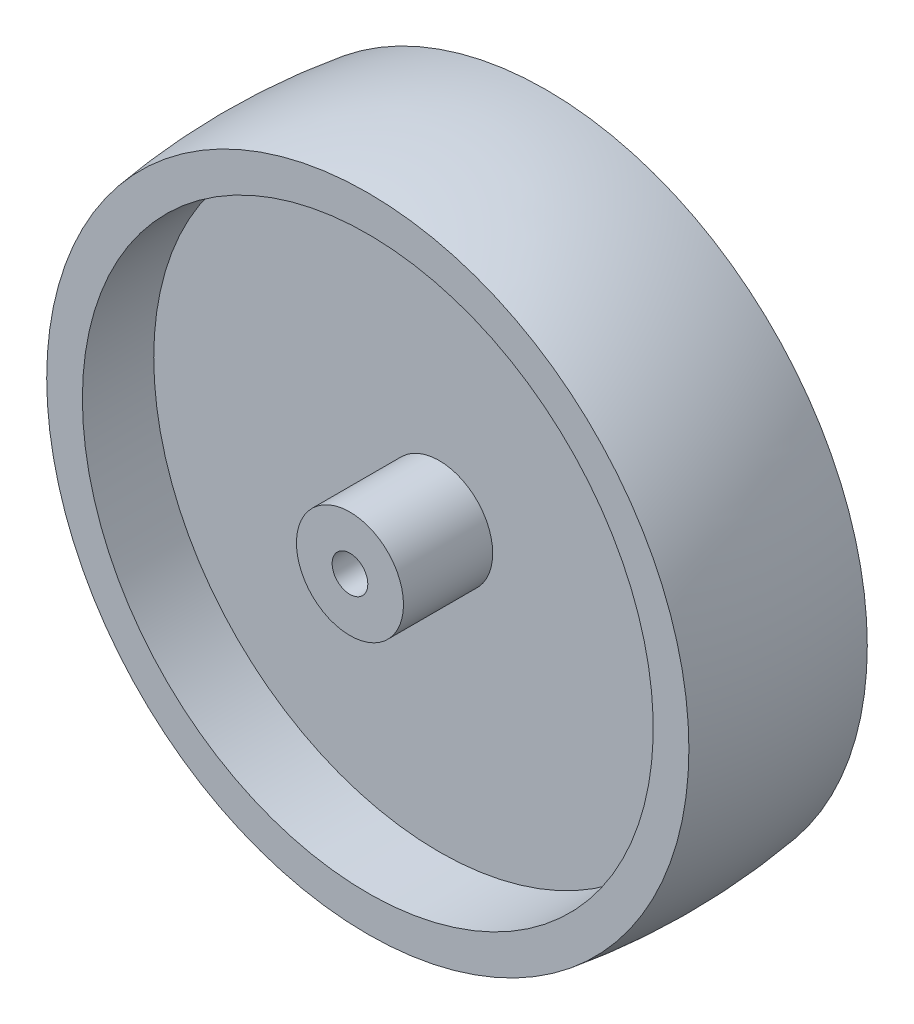
ISO-10303-21;
HEADER;
FILE_DESCRIPTION(('STEP AP214'),'2;1');
FILE_NAME('part.step','',(''),(''),'','','');
FILE_SCHEMA(('AUTOMOTIVE_DESIGN { 1 0 10303 214 1 1 1 1 }'));
ENDSEC;
DATA;
#1=APPLICATION_CONTEXT('core data for automotive mechanical design processes');
#2=APPLICATION_PROTOCOL_DEFINITION('international standard','automotive_design',2000,#1);
#3=PRODUCT_CONTEXT('',#1,'mechanical');
#4=PRODUCT('Part','Part','',(#3));
#5=PRODUCT_RELATED_PRODUCT_CATEGORY('part','',(#4));
#6=PRODUCT_DEFINITION_FORMATION('','',#4);
#7=PRODUCT_DEFINITION_CONTEXT('part definition',#1,'design');
#8=PRODUCT_DEFINITION('design','',#6,#7);
#9=PRODUCT_DEFINITION_SHAPE('','',#8);
#10=(LENGTH_UNIT() NAMED_UNIT(*) SI_UNIT(.MILLI.,.METRE.));
#11=(NAMED_UNIT(*) PLANE_ANGLE_UNIT() SI_UNIT($,.RADIAN.));
#12=(NAMED_UNIT(*) SI_UNIT($,.STERADIAN.) SOLID_ANGLE_UNIT());
#13=UNCERTAINTY_MEASURE_WITH_UNIT(LENGTH_MEASURE(1.E-05),#10,'distance_accuracy_value','');
#14=(GEOMETRIC_REPRESENTATION_CONTEXT(3) GLOBAL_UNCERTAINTY_ASSIGNED_CONTEXT((#13)) GLOBAL_UNIT_ASSIGNED_CONTEXT((#10,
#11,#12)) REPRESENTATION_CONTEXT('',''));
#15=CARTESIAN_POINT('',(0.,0.,0.));
#16=DIRECTION('',(0.,0.,1.));
#17=DIRECTION('',(1.,0.,0.));
#18=AXIS2_PLACEMENT_3D('',#15,#16,#17);
#19=CARTESIAN_POINT('',(0.,0.,60.));
#20=DIRECTION('',(0.,0.,-1.));
#21=DIRECTION('',(-1.,0.,0.));
#22=AXIS2_PLACEMENT_3D('',#19,#20,#21);
#23=CYLINDRICAL_SURFACE('',#22,15.);
#24=CARTESIAN_POINT('',(0.,0.,0.));
#25=DIRECTION('',(0.,0.,1.));
#26=DIRECTION('',(1.,0.,0.));
#27=AXIS2_PLACEMENT_3D('',#24,#25,#26);
#28=CIRCLE('',#27,15.);
#29=CARTESIAN_POINT('',(15.,0.,0.));
#30=VERTEX_POINT('',#29);
#31=EDGE_CURVE('E50',#30,#30,#28,.T.);
#32=ORIENTED_EDGE('',*,*,#31,.T.);
#33=EDGE_LOOP('',(#32));
#34=FACE_BOUND('',#33,.T.);
#35=CARTESIAN_POINT('',(0.,0.,25.));
#36=DIRECTION('',(0.,0.,1.));
#37=DIRECTION('',(1.,0.,0.));
#38=AXIS2_PLACEMENT_3D('',#35,#36,#37);
#39=CIRCLE('',#38,15.);
#40=CARTESIAN_POINT('',(15.,0.,25.));
#41=VERTEX_POINT('',#40);
#42=EDGE_CURVE('E10',#41,#41,#39,.T.);
#43=ORIENTED_EDGE('',*,*,#42,.F.);
#44=EDGE_LOOP('',(#43));
#45=FACE_BOUND('',#44,.T.);
#46=ADVANCED_FACE('F37',(#34,#45),#23,.T.);
#47=CARTESIAN_POINT('',(0.,0.,60.));
#48=DIRECTION('',(0.,0.,1.));
#49=DIRECTION('',(1.,0.,0.));
#50=AXIS2_PLACEMENT_3D('',#47,#48,#49);
#51=PLANE('',#50);
#52=CARTESIAN_POINT('',(0.,0.,60.));
#53=DIRECTION('',(0.,0.,1.));
#54=DIRECTION('',(1.,0.,0.));
#55=AXIS2_PLACEMENT_3D('',#52,#53,#54);
#56=CIRCLE('',#55,15.);
#57=CARTESIAN_POINT('',(15.,0.,60.));
#58=VERTEX_POINT('',#57);
#59=EDGE_CURVE('E45',#58,#58,#56,.T.);
#60=ORIENTED_EDGE('',*,*,#59,.T.);
#61=EDGE_LOOP('',(#60));
#62=FACE_BOUND('',#61,.T.);
#63=CARTESIAN_POINT('',(0.,0.,60.));
#64=DIRECTION('',(0.,0.,1.));
#65=DIRECTION('',(1.,0.,0.));
#66=AXIS2_PLACEMENT_3D('',#63,#64,#65);
#67=CIRCLE('',#66,5.);
#68=CARTESIAN_POINT('',(5.,0.,60.));
#69=VERTEX_POINT('',#68);
#70=EDGE_CURVE('E56',#69,#69,#67,.T.);
#71=ORIENTED_EDGE('',*,*,#70,.F.);
#72=EDGE_LOOP('',(#71));
#73=FACE_BOUND('',#72,.T.);
#74=ADVANCED_FACE('F114',(#62,#73),#51,.T.);
#75=CARTESIAN_POINT('',(0.,0.,0.));
#76=DIRECTION('',(0.,0.,1.));
#77=DIRECTION('',(1.,0.,0.));
#78=AXIS2_PLACEMENT_3D('',#75,#76,#77);
#79=PLANE('',#78);
#80=ORIENTED_EDGE('',*,*,#31,.F.);
#81=EDGE_LOOP('',(#80));
#82=FACE_BOUND('',#81,.T.);
#83=CARTESIAN_POINT('',(0.,0.,0.));
#84=DIRECTION('',(0.,0.,1.));
#85=DIRECTION('',(1.,0.,0.));
#86=AXIS2_PLACEMENT_3D('',#83,#84,#85);
#87=CIRCLE('',#86,5.);
#88=CARTESIAN_POINT('',(5.,0.,0.));
#89=VERTEX_POINT('',#88);
#90=EDGE_CURVE('E58',#89,#89,#87,.T.);
#91=ORIENTED_EDGE('',*,*,#90,.T.);
#92=EDGE_LOOP('',(#91));
#93=FACE_BOUND('',#92,.T.);
#94=ADVANCED_FACE('F119',(#82,#93),#79,.F.);
#95=CARTESIAN_POINT('',(0.,0.,35.));
#96=DIRECTION('',(0.,0.,1.));
#97=DIRECTION('',(1.,0.,0.));
#98=AXIS2_PLACEMENT_3D('',#95,#96,#97);
#99=CIRCLE('',#98,15.);
#100=CARTESIAN_POINT('',(15.,0.,35.));
#101=VERTEX_POINT('',#100);
#102=EDGE_CURVE('E69',#101,#101,#99,.T.);
#103=ORIENTED_EDGE('',*,*,#102,.T.);
#104=EDGE_LOOP('',(#103));
#105=FACE_BOUND('',#104,.T.);
#106=ORIENTED_EDGE('',*,*,#59,.F.);
#107=EDGE_LOOP('',(#106));
#108=FACE_BOUND('',#107,.T.);
#109=ADVANCED_FACE('F39',(#105,#108),#23,.T.);
#110=CARTESIAN_POINT('',(0.,0.,60.));
#111=DIRECTION('',(0.,0.,-1.));
#112=DIRECTION('',(-1.,0.,0.));
#113=AXIS2_PLACEMENT_3D('',#110,#111,#112);
#114=CYLINDRICAL_SURFACE('',#113,5.);
#115=ORIENTED_EDGE('',*,*,#70,.T.);
#116=EDGE_LOOP('',(#115));
#117=FACE_BOUND('',#116,.T.);
#118=ORIENTED_EDGE('',*,*,#90,.F.);
#119=EDGE_LOOP('',(#118));
#120=FACE_BOUND('',#119,.T.);
#121=ADVANCED_FACE('F123',(#117,#120),#114,.F.);
#122=CARTESIAN_POINT('',(0.,0.,35.));
#123=DIRECTION('',(0.,0.,1.));
#124=DIRECTION('',(1.,0.,0.));
#125=AXIS2_PLACEMENT_3D('',#122,#123,#124);
#126=PLANE('',#125);
#127=CARTESIAN_POINT('',(0.,0.,35.));
#128=DIRECTION('',(0.,0.,1.));
#129=DIRECTION('',(1.,0.,0.));
#130=AXIS2_PLACEMENT_3D('',#127,#128,#129);
#131=CIRCLE('',#130,80.);
#132=CARTESIAN_POINT('',(80.,0.,35.));
#133=VERTEX_POINT('',#132);
#134=EDGE_CURVE('E73',#133,#133,#131,.F.);
#135=ORIENTED_EDGE('',*,*,#134,.F.);
#136=EDGE_LOOP('',(#135));
#137=FACE_BOUND('',#136,.T.);
#138=ORIENTED_EDGE('',*,*,#102,.F.);
#139=EDGE_LOOP('',(#138));
#140=FACE_BOUND('',#139,.T.);
#141=ADVANCED_FACE('F129',(#137,#140),#126,.T.);
#142=CARTESIAN_POINT('',(0.,0.,25.));
#143=DIRECTION('',(0.,0.,1.));
#144=DIRECTION('',(1.,0.,0.));
#145=AXIS2_PLACEMENT_3D('',#142,#143,#144);
#146=PLANE('',#145);
#147=CARTESIAN_POINT('',(0.,0.,25.));
#148=DIRECTION('',(0.,0.,1.));
#149=DIRECTION('',(1.,0.,0.));
#150=AXIS2_PLACEMENT_3D('',#147,#148,#149);
#151=CIRCLE('',#150,80.);
#152=CARTESIAN_POINT('',(80.,0.,25.));
#153=VERTEX_POINT('',#152);
#154=EDGE_CURVE('E62',#153,#153,#151,.T.);
#155=ORIENTED_EDGE('',*,*,#154,.F.);
#156=EDGE_LOOP('',(#155));
#157=FACE_BOUND('',#156,.T.);
#158=ORIENTED_EDGE('',*,*,#42,.T.);
#159=EDGE_LOOP('',(#158));
#160=FACE_BOUND('',#159,.T.);
#161=ADVANCED_FACE('F109',(#157,#160),#146,.F.);
#162=CARTESIAN_POINT('',(0.,0.,0.));
#163=DIRECTION('',(0.,0.,-1.));
#164=DIRECTION('',(-1.,0.,0.));
#165=AXIS2_PLACEMENT_3D('',#162,#163,#164);
#166=CYLINDRICAL_SURFACE('',#165,80.);
#167=CARTESIAN_POINT('',(0.,0.,4.99999999999999));
#168=DIRECTION('',(0.,0.,-1.));
#169=DIRECTION('',(-1.,0.,0.));
#170=AXIS2_PLACEMENT_3D('',#167,#168,#169);
#171=CIRCLE('',#170,80.);
#172=CARTESIAN_POINT('',(-80.,0.,4.99999999999999));
#173=VERTEX_POINT('',#172);
#174=EDGE_CURVE('E89',#173,#173,#171,.T.);
#175=ORIENTED_EDGE('',*,*,#174,.T.);
#176=EDGE_LOOP('',(#175));
#177=FACE_BOUND('',#176,.T.);
#178=ORIENTED_EDGE('',*,*,#154,.T.);
#179=EDGE_LOOP('',(#178));
#180=FACE_BOUND('',#179,.T.);
#181=ADVANCED_FACE('F94',(#177,#180),#166,.F.);
#182=CARTESIAN_POINT('',(0.,80.,5.));
#183=DIRECTION('',(0.,0.,-1.));
#184=DIRECTION('',(-1.,0.,0.));
#185=AXIS2_PLACEMENT_3D('',#182,#183,#184);
#186=PLANE('',#185);
#187=CARTESIAN_POINT('',(0.,0.,5.));
#188=DIRECTION('',(0.,0.,-1.));
#189=DIRECTION('',(-1.,0.,0.));
#190=AXIS2_PLACEMENT_3D('',#187,#188,#189);
#191=CIRCLE('',#190,90.);
#192=CARTESIAN_POINT('',(-90.,0.,5.));
#193=VERTEX_POINT('',#192);
#194=EDGE_CURVE('E77',#193,#193,#191,.T.);
#195=ORIENTED_EDGE('',*,*,#194,.T.);
#196=EDGE_LOOP('',(#195));
#197=FACE_BOUND('',#196,.T.);
#198=ORIENTED_EDGE('',*,*,#174,.F.);
#199=EDGE_LOOP('',(#198));
#200=FACE_BOUND('',#199,.T.);
#201=ADVANCED_FACE('F97',(#197,#200),#186,.T.);
#202=CARTESIAN_POINT('',(0.,0.,30.));
#203=DIRECTION('',(0.,0.,-1.));
#204=DIRECTION('',(-1.,0.,0.));
#205=AXIS2_PLACEMENT_3D('',#202,#203,#204);
#206=DEGENERATE_TOROIDAL_SURFACE('',#205,88.2554346997588,180.,.F.);
#207=CARTESIAN_POINT('',(0.,0.,55.));
#208=DIRECTION('',(0.,0.,-1.));
#209=DIRECTION('',(-1.,0.,0.));
#210=AXIS2_PLACEMENT_3D('',#207,#208,#209);
#211=CIRCLE('',#210,90.);
#212=CARTESIAN_POINT('',(-90.,0.,55.));
#213=VERTEX_POINT('',#212);
#214=EDGE_CURVE('E81',#213,#213,#211,.T.);
#215=ORIENTED_EDGE('',*,*,#214,.T.);
#216=EDGE_LOOP('',(#215));
#217=FACE_BOUND('',#216,.T.);
#218=ORIENTED_EDGE('',*,*,#194,.F.);
#219=EDGE_LOOP('',(#218));
#220=FACE_BOUND('',#219,.T.);
#221=ADVANCED_FACE('F99',(#217,#220),#206,.F.);
#222=CARTESIAN_POINT('',(0.,80.,55.));
#223=DIRECTION('',(0.,0.,1.));
#224=DIRECTION('',(1.,0.,0.));
#225=AXIS2_PLACEMENT_3D('',#222,#223,#224);
#226=PLANE('',#225);
#227=CARTESIAN_POINT('',(0.,0.,55.));
#228=DIRECTION('',(0.,0.,-1.));
#229=DIRECTION('',(-1.,0.,0.));
#230=AXIS2_PLACEMENT_3D('',#227,#228,#229);
#231=CIRCLE('',#230,80.);
#232=CARTESIAN_POINT('',(-80.,0.,55.));
#233=VERTEX_POINT('',#232);
#234=EDGE_CURVE('E85',#233,#233,#231,.T.);
#235=ORIENTED_EDGE('',*,*,#234,.T.);
#236=EDGE_LOOP('',(#235));
#237=FACE_BOUND('',#236,.T.);
#238=ORIENTED_EDGE('',*,*,#214,.F.);
#239=EDGE_LOOP('',(#238));
#240=FACE_BOUND('',#239,.T.);
#241=ADVANCED_FACE('F106',(#237,#240),#226,.T.);
#242=ORIENTED_EDGE('',*,*,#134,.T.);
#243=EDGE_LOOP('',(#242));
#244=FACE_BOUND('',#243,.T.);
#245=ORIENTED_EDGE('',*,*,#234,.F.);
#246=EDGE_LOOP('',(#245));
#247=FACE_BOUND('',#246,.T.);
#248=ADVANCED_FACE('F111',(#244,#247),#166,.F.);
#249=CLOSED_SHELL('',(#46,#74,#94,#109,#121,#141,#161,#181,#201,#221,#241,#248));
#250=MANIFOLD_SOLID_BREP('B2',#249);
#251=ADVANCED_BREP_SHAPE_REPRESENTATION('',(#18,#250),#14);
#252=SHAPE_DEFINITION_REPRESENTATION(#9,#251);
ENDSEC;
END-ISO-10303-21;
